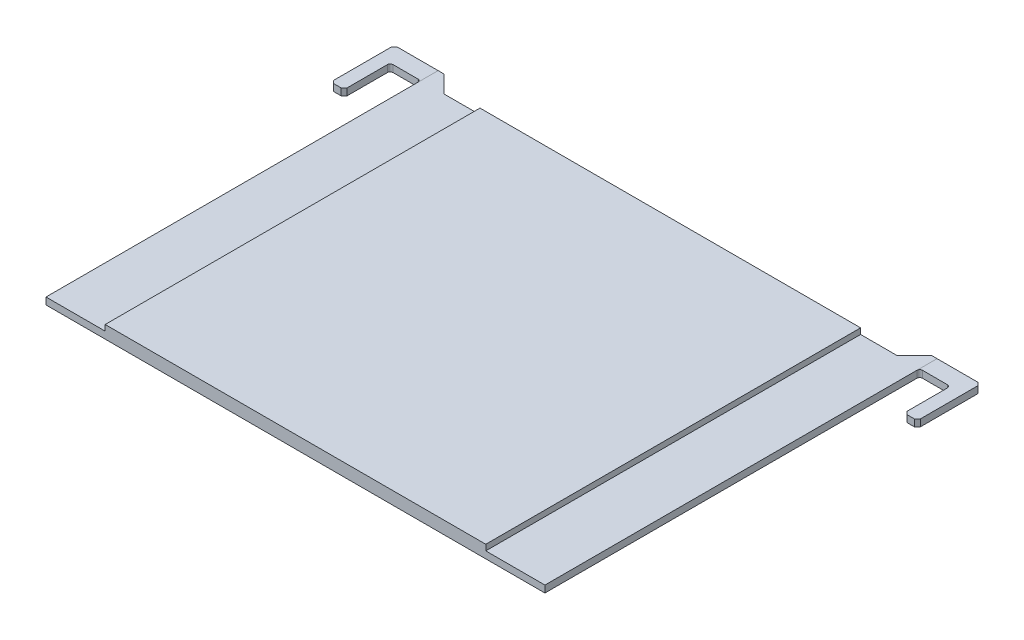
ISO-10303-21;
HEADER;
FILE_DESCRIPTION(('STEP AP214'),'2;1');
FILE_NAME('part.step','',(''),(''),'','','');
FILE_SCHEMA(('AUTOMOTIVE_DESIGN { 1 0 10303 214 1 1 1 1 }'));
ENDSEC;
DATA;
#1=APPLICATION_CONTEXT('core data for automotive mechanical design processes');
#2=APPLICATION_PROTOCOL_DEFINITION('international standard','automotive_design',2000,#1);
#3=PRODUCT_CONTEXT('',#1,'mechanical');
#4=PRODUCT('Part','Part','',(#3));
#5=PRODUCT_RELATED_PRODUCT_CATEGORY('part','',(#4));
#6=PRODUCT_DEFINITION_FORMATION('','',#4);
#7=PRODUCT_DEFINITION_CONTEXT('part definition',#1,'design');
#8=PRODUCT_DEFINITION('design','',#6,#7);
#9=PRODUCT_DEFINITION_SHAPE('','',#8);
#10=(LENGTH_UNIT() NAMED_UNIT(*) SI_UNIT(.MILLI.,.METRE.));
#11=(NAMED_UNIT(*) PLANE_ANGLE_UNIT() SI_UNIT($,.RADIAN.));
#12=(NAMED_UNIT(*) SI_UNIT($,.STERADIAN.) SOLID_ANGLE_UNIT());
#13=UNCERTAINTY_MEASURE_WITH_UNIT(LENGTH_MEASURE(1.E-05),#10,'distance_accuracy_value','');
#14=(GEOMETRIC_REPRESENTATION_CONTEXT(3) GLOBAL_UNCERTAINTY_ASSIGNED_CONTEXT((#13)) GLOBAL_UNIT_ASSIGNED_CONTEXT((#10,
#11,#12)) REPRESENTATION_CONTEXT('',''));
#15=CARTESIAN_POINT('',(0.,0.,0.));
#16=DIRECTION('',(0.,0.,1.));
#17=DIRECTION('',(1.,0.,0.));
#18=AXIS2_PLACEMENT_3D('',#15,#16,#17);
#19=CARTESIAN_POINT('',(0.,0.,-32.49));
#20=DIRECTION('',(0.,0.,-1.));
#21=DIRECTION('',(-1.,0.,0.));
#22=AXIS2_PLACEMENT_3D('',#19,#20,#21);
#23=PLANE('',#22);
#24=DIRECTION('',(-1.,0.,0.));
#25=VECTOR('',#24,1.);
#26=CARTESIAN_POINT('',(0.,0.,-32.49));
#27=LINE('',#26,#25);
#28=CARTESIAN_POINT('',(48.0591395479017,0.,-32.49));
#29=VERTEX_POINT('',#28);
#30=CARTESIAN_POINT('',(43.76,0.,-32.49));
#31=VERTEX_POINT('',#30);
#32=EDGE_CURVE('E291',#29,#31,#27,.T.);
#33=ORIENTED_EDGE('',*,*,#32,.F.);
#34=DIRECTION('',(0.,-1.,0.));
#35=VECTOR('',#34,1.);
#36=CARTESIAN_POINT('',(48.0591395479017,1.19907431198226,-32.49));
#37=LINE('',#36,#35);
#38=CARTESIAN_POINT('',(48.0591395479017,1.19907431198228,-32.49));
#39=VERTEX_POINT('',#38);
#40=EDGE_CURVE('E467',#29,#39,#37,.F.);
#41=ORIENTED_EDGE('',*,*,#40,.T.);
#42=DIRECTION('',(1.,0.,0.));
#43=VECTOR('',#42,1.);
#44=CARTESIAN_POINT('',(0.,1.19907431198248,-32.49));
#45=LINE('',#44,#43);
#46=CARTESIAN_POINT('',(43.76,1.19907431198229,-32.49));
#47=VERTEX_POINT('',#46);
#48=EDGE_CURVE('E297',#47,#39,#45,.T.);
#49=ORIENTED_EDGE('',*,*,#48,.F.);
#50=DIRECTION('',(0.,-1.,0.));
#51=VECTOR('',#50,1.);
#52=CARTESIAN_POINT('',(43.76,0.,-32.49));
#53=LINE('',#52,#51);
#54=EDGE_CURVE('E464',#47,#31,#53,.T.);
#55=ORIENTED_EDGE('',*,*,#54,.T.);
#56=EDGE_LOOP('',(#33,#41,#49,#55));
#57=FACE_BOUND('',#56,.T.);
#58=ADVANCED_FACE('F41',(#57),#23,.F.);
#59=CARTESIAN_POINT('',(-43.26,1.2,-32.5));
#60=DIRECTION('',(0.,0.,1.));
#61=DIRECTION('',(1.,0.,0.));
#62=AXIS2_PLACEMENT_3D('',#59,#60,#61);
#63=PLANE('',#62);
#64=DIRECTION('',(-1.,0.,0.));
#65=VECTOR('',#64,1.);
#66=CARTESIAN_POINT('',(-43.26,0.,-32.5));
#67=LINE('',#66,#65);
#68=CARTESIAN_POINT('',(39.26,0.,-32.5));
#69=VERTEX_POINT('',#68);
#70=CARTESIAN_POINT('',(-39.26,0.,-32.5));
#71=VERTEX_POINT('',#70);
#72=EDGE_CURVE('E365',#69,#71,#67,.T.);
#73=ORIENTED_EDGE('',*,*,#72,.T.);
#74=DIRECTION('',(0.,1.,0.));
#75=VECTOR('',#74,1.);
#76=CARTESIAN_POINT('',(-39.26,1.2,-32.5));
#77=LINE('',#76,#75);
#78=CARTESIAN_POINT('',(-39.26,1.2,-32.5));
#79=VERTEX_POINT('',#78);
#80=EDGE_CURVE('E396',#71,#79,#77,.T.);
#81=ORIENTED_EDGE('',*,*,#80,.T.);
#82=DIRECTION('',(-1.,0.,0.));
#83=VECTOR('',#82,1.);
#84=CARTESIAN_POINT('',(-43.26,1.2,-32.5));
#85=LINE('',#84,#83);
#86=CARTESIAN_POINT('',(-33.,1.2,-32.5));
#87=VERTEX_POINT('',#86);
#88=EDGE_CURVE('E282',#87,#79,#85,.T.);
#89=ORIENTED_EDGE('',*,*,#88,.F.);
#90=DIRECTION('',(0.,1.,0.));
#91=VECTOR('',#90,1.);
#92=CARTESIAN_POINT('',(-33.,1.2,-32.5));
#93=LINE('',#92,#91);
#94=CARTESIAN_POINT('',(-33.,2.2,-32.5));
#95=VERTEX_POINT('',#94);
#96=EDGE_CURVE('E338',#87,#95,#93,.T.);
#97=ORIENTED_EDGE('',*,*,#96,.T.);
#98=DIRECTION('',(1.,0.,0.));
#99=VECTOR('',#98,1.);
#100=CARTESIAN_POINT('',(-33.,2.2,-32.5));
#101=LINE('',#100,#99);
#102=CARTESIAN_POINT('',(33.,2.2,-32.5));
#103=VERTEX_POINT('',#102);
#104=EDGE_CURVE('E335',#95,#103,#101,.T.);
#105=ORIENTED_EDGE('',*,*,#104,.T.);
#106=DIRECTION('',(0.,-1.,0.));
#107=VECTOR('',#106,1.);
#108=CARTESIAN_POINT('',(33.,1.2,-32.5));
#109=LINE('',#108,#107);
#110=CARTESIAN_POINT('',(33.,1.2,-32.5));
#111=VERTEX_POINT('',#110);
#112=EDGE_CURVE('E332',#103,#111,#109,.T.);
#113=ORIENTED_EDGE('',*,*,#112,.T.);
#114=CARTESIAN_POINT('',(39.26,1.2,-32.5));
#115=VERTEX_POINT('',#114);
#116=EDGE_CURVE('E357',#115,#111,#85,.T.);
#117=ORIENTED_EDGE('',*,*,#116,.F.);
#118=DIRECTION('',(0.,-1.,0.));
#119=VECTOR('',#118,1.);
#120=CARTESIAN_POINT('',(39.26,0.,-32.5));
#121=LINE('',#120,#119);
#122=EDGE_CURVE('E394',#115,#69,#121,.T.);
#123=ORIENTED_EDGE('',*,*,#122,.T.);
#124=EDGE_LOOP('',(#73,#81,#89,#97,#105,#113,#117,#123));
#125=FACE_BOUND('',#124,.T.);
#126=ADVANCED_FACE('F537',(#125),#63,.F.);
#127=CARTESIAN_POINT('',(-43.26,1.2,32.5));
#128=DIRECTION('',(1.,0.,0.));
#129=DIRECTION('',(0.,0.,-1.));
#130=AXIS2_PLACEMENT_3D('',#127,#128,#129);
#131=PLANE('',#130);
#132=DIRECTION('',(0.,0.,-1.));
#133=VECTOR('',#132,1.);
#134=CARTESIAN_POINT('',(-43.26,1.19907431198226,-32.49));
#135=LINE('',#134,#133);
#136=CARTESIAN_POINT('',(-43.26,1.19907431198226,-31.99));
#137=VERTEX_POINT('',#136);
#138=CARTESIAN_POINT('',(-43.26,1.19907431198226,-35.5));
#139=VERTEX_POINT('',#138);
#140=EDGE_CURVE('E56',#137,#139,#135,.T.);
#141=ORIENTED_EDGE('',*,*,#140,.F.);
#142=DIRECTION('',(0.,1.,0.));
#143=VECTOR('',#142,1.);
#144=CARTESIAN_POINT('',(-43.26,0.,-31.99));
#145=LINE('',#144,#143);
#146=CARTESIAN_POINT('',(-43.26,0.,-31.99));
#147=VERTEX_POINT('',#146);
#148=EDGE_CURVE('E61',#137,#147,#145,.F.);
#149=ORIENTED_EDGE('',*,*,#148,.T.);
#150=DIRECTION('',(0.,0.,1.));
#151=VECTOR('',#150,1.);
#152=CARTESIAN_POINT('',(-43.26,0.,32.5));
#153=LINE('',#152,#151);
#154=CARTESIAN_POINT('',(-43.26,0.,32.5));
#155=VERTEX_POINT('',#154);
#156=EDGE_CURVE('E368',#147,#155,#153,.T.);
#157=ORIENTED_EDGE('',*,*,#156,.T.);
#158=DIRECTION('',(0.,-1.,0.));
#159=VECTOR('',#158,1.);
#160=CARTESIAN_POINT('',(-43.26,1.2,32.5));
#161=LINE('',#160,#159);
#162=CARTESIAN_POINT('',(-43.26,1.2,32.5));
#163=VERTEX_POINT('',#162);
#164=EDGE_CURVE('E372',#163,#155,#161,.T.);
#165=ORIENTED_EDGE('',*,*,#164,.F.);
#166=DIRECTION('',(0.,0.,1.));
#167=VECTOR('',#166,1.);
#168=CARTESIAN_POINT('',(-43.26,1.2,32.5));
#169=LINE('',#168,#167);
#170=CARTESIAN_POINT('',(-43.26,1.2,-35.5));
#171=VERTEX_POINT('',#170);
#172=EDGE_CURVE('E359',#171,#163,#169,.T.);
#173=ORIENTED_EDGE('',*,*,#172,.F.);
#174=DIRECTION('',(0.,1.,0.));
#175=VECTOR('',#174,1.);
#176=CARTESIAN_POINT('',(-43.26,0.,-35.5));
#177=LINE('',#176,#175);
#178=EDGE_CURVE('E312',#139,#171,#177,.T.);
#179=ORIENTED_EDGE('',*,*,#178,.F.);
#180=EDGE_LOOP('',(#141,#149,#157,#165,#173,#179));
#181=FACE_BOUND('',#180,.T.);
#182=ADVANCED_FACE('F563',(#181),#131,.F.);
#183=CARTESIAN_POINT('',(0.,1.2,0.));
#184=DIRECTION('',(0.,-1.,0.));
#185=DIRECTION('',(0.,0.,-1.));
#186=AXIS2_PLACEMENT_3D('',#183,#184,#185);
#187=PLANE('',#186);
#188=ORIENTED_EDGE('',*,*,#88,.T.);
#189=DIRECTION('',(-0.707106781186552,0.,-0.707106781186543));
#190=VECTOR('',#189,1.);
#191=CARTESIAN_POINT('',(-3.37999999999973,1.2,3.37999999999977));
#192=LINE('',#191,#190);
#193=CARTESIAN_POINT('',(-40.26,1.2,-33.5));
#194=VERTEX_POINT('',#193);
#195=EDGE_CURVE('E399',#79,#194,#192,.T.);
#196=ORIENTED_EDGE('',*,*,#195,.T.);
#197=DIRECTION('',(0.707106781186545,0.,0.70710678118655));
#198=VECTOR('',#197,1.);
#199=CARTESIAN_POINT('',(-42.26,1.2,-35.5));
#200=LINE('',#199,#198);
#201=CARTESIAN_POINT('',(-42.26,1.2,-35.5));
#202=VERTEX_POINT('',#201);
#203=EDGE_CURVE('E392',#194,#202,#200,.F.);
#204=ORIENTED_EDGE('',*,*,#203,.T.);
#205=DIRECTION('',(1.,0.,0.));
#206=VECTOR('',#205,1.);
#207=CARTESIAN_POINT('',(0.,1.2,-35.5));
#208=LINE('',#207,#206);
#209=EDGE_CURVE('E315',#171,#202,#208,.T.);
#210=ORIENTED_EDGE('',*,*,#209,.F.);
#211=ORIENTED_EDGE('',*,*,#172,.T.);
#212=DIRECTION('',(1.,0.,0.));
#213=VECTOR('',#212,1.);
#214=CARTESIAN_POINT('',(-43.26,1.2,32.5));
#215=LINE('',#214,#213);
#216=CARTESIAN_POINT('',(-33.,1.2,32.5));
#217=VERTEX_POINT('',#216);
#218=EDGE_CURVE('E361',#163,#217,#215,.T.);
#219=ORIENTED_EDGE('',*,*,#218,.T.);
#220=DIRECTION('',(0.,0.,1.));
#221=VECTOR('',#220,1.);
#222=CARTESIAN_POINT('',(-33.,1.2,-98.507575322837));
#223=LINE('',#222,#221);
#224=EDGE_CURVE('E349',#87,#217,#223,.T.);
#225=ORIENTED_EDGE('',*,*,#224,.F.);
#226=EDGE_LOOP('',(#188,#196,#204,#210,#211,#219,#225));
#227=FACE_BOUND('',#226,.T.);
#228=ADVANCED_FACE('F603',(#227),#187,.F.);
#229=CARTESIAN_POINT('',(43.26,1.2,32.5));
#230=DIRECTION('',(-1.,0.,0.));
#231=DIRECTION('',(0.,0.,1.));
#232=AXIS2_PLACEMENT_3D('',#229,#230,#231);
#233=PLANE('',#232);
#234=DIRECTION('',(0.,0.,-1.));
#235=VECTOR('',#234,1.);
#236=CARTESIAN_POINT('',(43.26,0.,32.5));
#237=LINE('',#236,#235);
#238=CARTESIAN_POINT('',(43.26,0.,32.5));
#239=VERTEX_POINT('',#238);
#240=CARTESIAN_POINT('',(43.26,0.,-31.99));
#241=VERTEX_POINT('',#240);
#242=EDGE_CURVE('E340',#239,#241,#237,.T.);
#243=ORIENTED_EDGE('',*,*,#242,.T.);
#244=DIRECTION('',(0.,-1.,0.));
#245=VECTOR('',#244,1.);
#246=CARTESIAN_POINT('',(43.26,1.19907431198228,-31.99));
#247=LINE('',#246,#245);
#248=CARTESIAN_POINT('',(43.26,1.1990743119823,-31.99));
#249=VERTEX_POINT('',#248);
#250=EDGE_CURVE('E469',#241,#249,#247,.F.);
#251=ORIENTED_EDGE('',*,*,#250,.T.);
#252=DIRECTION('',(0.,0.,-1.));
#253=VECTOR('',#252,1.);
#254=CARTESIAN_POINT('',(43.26,1.1990743119823,-32.49));
#255=LINE('',#254,#253);
#256=CARTESIAN_POINT('',(43.26,1.1990743119823,-35.5));
#257=VERTEX_POINT('',#256);
#258=EDGE_CURVE('E288',#249,#257,#255,.T.);
#259=ORIENTED_EDGE('',*,*,#258,.T.);
#260=DIRECTION('',(0.,-1.,0.));
#261=VECTOR('',#260,1.);
#262=CARTESIAN_POINT('',(43.26,0.,-35.5));
#263=LINE('',#262,#261);
#264=CARTESIAN_POINT('',(43.26,1.2,-35.5));
#265=VERTEX_POINT('',#264);
#266=EDGE_CURVE('E265',#265,#257,#263,.T.);
#267=ORIENTED_EDGE('',*,*,#266,.F.);
#268=DIRECTION('',(0.,0.,-1.));
#269=VECTOR('',#268,1.);
#270=CARTESIAN_POINT('',(43.26,1.2,32.5));
#271=LINE('',#270,#269);
#272=CARTESIAN_POINT('',(43.26,1.2,32.5));
#273=VERTEX_POINT('',#272);
#274=EDGE_CURVE('E275',#273,#265,#271,.T.);
#275=ORIENTED_EDGE('',*,*,#274,.F.);
#276=DIRECTION('',(0.,-1.,0.));
#277=VECTOR('',#276,1.);
#278=CARTESIAN_POINT('',(43.26,1.2,32.5));
#279=LINE('',#278,#277);
#280=EDGE_CURVE('E363',#273,#239,#279,.T.);
#281=ORIENTED_EDGE('',*,*,#280,.T.);
#282=EDGE_LOOP('',(#243,#251,#259,#267,#275,#281));
#283=FACE_BOUND('',#282,.T.);
#284=ADVANCED_FACE('F286',(#283),#233,.F.);
#285=CARTESIAN_POINT('',(-43.26,1.2,32.5));
#286=DIRECTION('',(0.,0.,-1.));
#287=DIRECTION('',(-1.,0.,0.));
#288=AXIS2_PLACEMENT_3D('',#285,#286,#287);
#289=PLANE('',#288);
#290=DIRECTION('',(1.,0.,0.));
#291=VECTOR('',#290,1.);
#292=CARTESIAN_POINT('',(-43.26,0.,32.5));
#293=LINE('',#292,#291);
#294=EDGE_CURVE('E283',#155,#239,#293,.T.);
#295=ORIENTED_EDGE('',*,*,#294,.T.);
#296=ORIENTED_EDGE('',*,*,#280,.F.);
#297=CARTESIAN_POINT('',(33.,1.2,32.5));
#298=VERTEX_POINT('',#297);
#299=EDGE_CURVE('E278',#298,#273,#215,.T.);
#300=ORIENTED_EDGE('',*,*,#299,.F.);
#301=DIRECTION('',(0.,1.,0.));
#302=VECTOR('',#301,1.);
#303=CARTESIAN_POINT('',(33.,1.2,32.5));
#304=LINE('',#303,#302);
#305=CARTESIAN_POINT('',(33.,2.2,32.5));
#306=VERTEX_POINT('',#305);
#307=EDGE_CURVE('E343',#298,#306,#304,.T.);
#308=ORIENTED_EDGE('',*,*,#307,.T.);
#309=DIRECTION('',(-1.,0.,0.));
#310=VECTOR('',#309,1.);
#311=CARTESIAN_POINT('',(-33.,2.2,32.5));
#312=LINE('',#311,#310);
#313=CARTESIAN_POINT('',(-33.,2.2,32.5));
#314=VERTEX_POINT('',#313);
#315=EDGE_CURVE('E346',#306,#314,#312,.T.);
#316=ORIENTED_EDGE('',*,*,#315,.T.);
#317=DIRECTION('',(0.,-1.,0.));
#318=VECTOR('',#317,1.);
#319=CARTESIAN_POINT('',(-33.,1.2,32.5));
#320=LINE('',#319,#318);
#321=EDGE_CURVE('E326',#314,#217,#320,.T.);
#322=ORIENTED_EDGE('',*,*,#321,.T.);
#323=ORIENTED_EDGE('',*,*,#218,.F.);
#324=ORIENTED_EDGE('',*,*,#164,.T.);
#325=EDGE_LOOP('',(#295,#296,#300,#308,#316,#322,#323,#324));
#326=FACE_BOUND('',#325,.T.);
#327=ADVANCED_FACE('F602',(#326),#289,.F.);
#328=DIRECTION('',(1.,0.,0.));
#329=VECTOR('',#328,1.);
#330=CARTESIAN_POINT('',(0.,1.2,-35.5));
#331=LINE('',#330,#329);
#332=CARTESIAN_POINT('',(42.26,1.2,-35.5));
#333=VERTEX_POINT('',#332);
#334=EDGE_CURVE('E260',#333,#265,#331,.T.);
#335=ORIENTED_EDGE('',*,*,#334,.F.);
#336=DIRECTION('',(-0.70710678118655,0.,0.707106781186545));
#337=VECTOR('',#336,1.);
#338=CARTESIAN_POINT('',(40.26,1.2,-33.5));
#339=LINE('',#338,#337);
#340=CARTESIAN_POINT('',(40.26,1.2,-33.5));
#341=VERTEX_POINT('',#340);
#342=EDGE_CURVE('E382',#333,#341,#339,.T.);
#343=ORIENTED_EDGE('',*,*,#342,.T.);
#344=DIRECTION('',(0.707106781186543,0.,-0.707106781186552));
#345=VECTOR('',#344,1.);
#346=CARTESIAN_POINT('',(3.38000000000026,1.2,3.38000000000021));
#347=LINE('',#346,#345);
#348=EDGE_CURVE('E403',#341,#115,#347,.F.);
#349=ORIENTED_EDGE('',*,*,#348,.T.);
#350=ORIENTED_EDGE('',*,*,#116,.T.);
#351=DIRECTION('',(0.,0.,1.));
#352=VECTOR('',#351,1.);
#353=CARTESIAN_POINT('',(33.,1.2,-98.507575322837));
#354=LINE('',#353,#352);
#355=EDGE_CURVE('E353',#111,#298,#354,.T.);
#356=ORIENTED_EDGE('',*,*,#355,.T.);
#357=ORIENTED_EDGE('',*,*,#299,.T.);
#358=ORIENTED_EDGE('',*,*,#274,.T.);
#359=EDGE_LOOP('',(#335,#343,#349,#350,#356,#357,#358));
#360=FACE_BOUND('',#359,.T.);
#361=ADVANCED_FACE('F276',(#360),#187,.F.);
#362=CARTESIAN_POINT('',(0.,0.,0.));
#363=DIRECTION('',(0.,-1.,0.));
#364=DIRECTION('',(0.,0.,-1.));
#365=AXIS2_PLACEMENT_3D('',#362,#363,#364);
#366=PLANE('',#365);
#367=DIRECTION('',(0.,0.,-1.));
#368=VECTOR('',#367,1.);
#369=CARTESIAN_POINT('',(-48.5591395479017,0.,-24.49));
#370=LINE('',#369,#368);
#371=CARTESIAN_POINT('',(-48.5591395479017,0.,-24.99));
#372=VERTEX_POINT('',#371);
#373=CARTESIAN_POINT('',(-48.5591395479017,0.,-31.99));
#374=VERTEX_POINT('',#373);
#375=EDGE_CURVE('E511',#372,#374,#370,.T.);
#376=ORIENTED_EDGE('',*,*,#375,.F.);
#377=DIRECTION('',(0.707106781186548,0.,-0.707106781186548));
#378=VECTOR('',#377,1.);
#379=CARTESIAN_POINT('',(-36.7745697739508,0.,-36.7745697739508));
#380=LINE('',#379,#378);
#381=CARTESIAN_POINT('',(-49.0591395479017,0.,-24.49));
#382=VERTEX_POINT('',#381);
#383=EDGE_CURVE('E420',#372,#382,#380,.F.);
#384=ORIENTED_EDGE('',*,*,#383,.T.);
#385=DIRECTION('',(1.,0.,0.));
#386=VECTOR('',#385,1.);
#387=CARTESIAN_POINT('',(0.,0.,-24.49));
#388=LINE('',#387,#386);
#389=CARTESIAN_POINT('',(-50.3591395479017,0.,-24.49));
#390=VERTEX_POINT('',#389);
#391=EDGE_CURVE('E518',#390,#382,#388,.T.);
#392=ORIENTED_EDGE('',*,*,#391,.F.);
#393=DIRECTION('',(-0.707106781186548,0.,-0.707106781186548));
#394=VECTOR('',#393,1.);
#395=CARTESIAN_POINT('',(-12.9345697739509,0.,12.9345697739509));
#396=LINE('',#395,#394);
#397=CARTESIAN_POINT('',(-50.8591395479017,0.,-24.99));
#398=VERTEX_POINT('',#397);
#399=EDGE_CURVE('E418',#390,#398,#396,.T.);
#400=ORIENTED_EDGE('',*,*,#399,.T.);
#401=DIRECTION('',(0.,0.,-1.));
#402=VECTOR('',#401,1.);
#403=CARTESIAN_POINT('',(-50.8591395479017,0.,-32.49));
#404=LINE('',#403,#402);
#405=CARTESIAN_POINT('',(-50.8591395479017,0.,-35.));
#406=VERTEX_POINT('',#405);
#407=EDGE_CURVE('E324',#398,#406,#404,.T.);
#408=ORIENTED_EDGE('',*,*,#407,.T.);
#409=DIRECTION('',(0.707106781186548,0.,-0.707106781186548));
#410=VECTOR('',#409,1.);
#411=CARTESIAN_POINT('',(-42.9295697739508,0.,-42.9295697739508));
#412=LINE('',#411,#410);
#413=CARTESIAN_POINT('',(-50.3591395479017,0.,-35.5));
#414=VERTEX_POINT('',#413);
#415=EDGE_CURVE('E416',#406,#414,#412,.T.);
#416=ORIENTED_EDGE('',*,*,#415,.T.);
#417=DIRECTION('',(1.,0.,0.));
#418=VECTOR('',#417,1.);
#419=CARTESIAN_POINT('',(0.,0.,-35.5));
#420=LINE('',#419,#418);
#421=CARTESIAN_POINT('',(-42.26,0.,-35.5));
#422=VERTEX_POINT('',#421);
#423=EDGE_CURVE('E303',#414,#422,#420,.T.);
#424=ORIENTED_EDGE('',*,*,#423,.T.);
#425=DIRECTION('',(-0.707106781186545,0.,-0.70710678118655));
#426=VECTOR('',#425,1.);
#427=CARTESIAN_POINT('',(-3.38000000000015,0.,3.38000000000013));
#428=LINE('',#427,#426);
#429=CARTESIAN_POINT('',(-40.26,0.,-33.5));
#430=VERTEX_POINT('',#429);
#431=EDGE_CURVE('E387',#422,#430,#428,.F.);
#432=ORIENTED_EDGE('',*,*,#431,.T.);
#433=DIRECTION('',(0.707106781186552,0.,0.707106781186543));
#434=VECTOR('',#433,1.);
#435=CARTESIAN_POINT('',(-39.26,0.,-32.5));
#436=LINE('',#435,#434);
#437=EDGE_CURVE('E401',#430,#71,#436,.T.);
#438=ORIENTED_EDGE('',*,*,#437,.T.);
#439=ORIENTED_EDGE('',*,*,#72,.F.);
#440=DIRECTION('',(-0.707106781186543,0.,0.707106781186552));
#441=VECTOR('',#440,1.);
#442=CARTESIAN_POINT('',(40.26,0.,-33.5));
#443=LINE('',#442,#441);
#444=CARTESIAN_POINT('',(40.26,0.,-33.5));
#445=VERTEX_POINT('',#444);
#446=EDGE_CURVE('E405',#69,#445,#443,.F.);
#447=ORIENTED_EDGE('',*,*,#446,.T.);
#448=DIRECTION('',(0.70710678118655,0.,-0.707106781186545));
#449=VECTOR('',#448,1.);
#450=CARTESIAN_POINT('',(3.37999999999985,0.,3.37999999999987));
#451=LINE('',#450,#449);
#452=CARTESIAN_POINT('',(42.26,0.,-35.5));
#453=VERTEX_POINT('',#452);
#454=EDGE_CURVE('E378',#445,#453,#451,.T.);
#455=ORIENTED_EDGE('',*,*,#454,.T.);
#456=DIRECTION('',(-1.,0.,0.));
#457=VECTOR('',#456,1.);
#458=CARTESIAN_POINT('',(0.,0.,-35.5));
#459=LINE('',#458,#457);
#460=CARTESIAN_POINT('',(50.3591395479017,0.,-35.5));
#461=VERTEX_POINT('',#460);
#462=EDGE_CURVE('E272',#461,#453,#459,.T.);
#463=ORIENTED_EDGE('',*,*,#462,.F.);
#464=DIRECTION('',(-0.707106781186548,0.,-0.707106781186548));
#465=VECTOR('',#464,1.);
#466=CARTESIAN_POINT('',(42.9295697739508,0.,-42.9295697739508));
#467=LINE('',#466,#465);
#468=CARTESIAN_POINT('',(50.8591395479017,0.,-35.));
#469=VERTEX_POINT('',#468);
#470=EDGE_CURVE('E414',#461,#469,#467,.F.);
#471=ORIENTED_EDGE('',*,*,#470,.T.);
#472=DIRECTION('',(0.,0.,-1.));
#473=VECTOR('',#472,1.);
#474=CARTESIAN_POINT('',(50.8591395479017,0.,-32.49));
#475=LINE('',#474,#473);
#476=CARTESIAN_POINT('',(50.8591395479017,0.,-24.99));
#477=VERTEX_POINT('',#476);
#478=EDGE_CURVE('E300',#477,#469,#475,.T.);
#479=ORIENTED_EDGE('',*,*,#478,.F.);
#480=DIRECTION('',(0.707106781186548,0.,-0.707106781186548));
#481=VECTOR('',#480,1.);
#482=CARTESIAN_POINT('',(12.9345697739508,0.,12.9345697739508));
#483=LINE('',#482,#481);
#484=CARTESIAN_POINT('',(50.3591395479017,-7.53238472798928E-13,-24.49));
#485=VERTEX_POINT('',#484);
#486=EDGE_CURVE('E412',#477,#485,#483,.F.);
#487=ORIENTED_EDGE('',*,*,#486,.T.);
#488=DIRECTION('',(-1.,4.1846581822163E-13,0.));
#489=VECTOR('',#488,1.);
#490=CARTESIAN_POINT('',(0.,2.0320340063051E-11,-24.49));
#491=LINE('',#490,#489);
#492=CARTESIAN_POINT('',(49.0591395479017,-2.09232909110809E-13,-24.49));
#493=VERTEX_POINT('',#492);
#494=EDGE_CURVE('E1102',#485,#493,#491,.T.);
#495=ORIENTED_EDGE('',*,*,#494,.T.);
#496=DIRECTION('',(-0.707106781186548,0.,-0.707106781186548));
#497=VECTOR('',#496,1.);
#498=CARTESIAN_POINT('',(36.7745697739508,0.,-36.7745697739508));
#499=LINE('',#498,#497);
#500=CARTESIAN_POINT('',(48.5591395479017,0.,-24.99));
#501=VERTEX_POINT('',#500);
#502=EDGE_CURVE('E410',#493,#501,#499,.T.);
#503=ORIENTED_EDGE('',*,*,#502,.T.);
#504=DIRECTION('',(0.,0.,-1.));
#505=VECTOR('',#504,1.);
#506=CARTESIAN_POINT('',(48.5591395479017,0.,-24.49));
#507=LINE('',#506,#505);
#508=CARTESIAN_POINT('',(48.5591395479017,0.,-31.99));
#509=VERTEX_POINT('',#508);
#510=EDGE_CURVE('E1098',#501,#509,#507,.T.);
#511=ORIENTED_EDGE('',*,*,#510,.T.);
#512=CARTESIAN_POINT('',(48.0591395479017,0.,-31.99));
#513=DIRECTION('',(0.,-1.,0.));
#514=DIRECTION('',(0.,0.,-1.));
#515=AXIS2_PLACEMENT_3D('',#512,#513,#514);
#516=CIRCLE('',#515,0.5);
#517=EDGE_CURVE('E480',#509,#29,#516,.F.);
#518=ORIENTED_EDGE('',*,*,#517,.T.);
#519=ORIENTED_EDGE('',*,*,#32,.T.);
#520=CARTESIAN_POINT('',(43.76,0.,-31.99));
#521=DIRECTION('',(0.,-1.,0.));
#522=DIRECTION('',(0.,0.,-1.));
#523=AXIS2_PLACEMENT_3D('',#520,#521,#522);
#524=CIRCLE('',#523,0.5);
#525=EDGE_CURVE('E484',#31,#241,#524,.F.);
#526=ORIENTED_EDGE('',*,*,#525,.T.);
#527=ORIENTED_EDGE('',*,*,#242,.F.);
#528=ORIENTED_EDGE('',*,*,#294,.F.);
#529=ORIENTED_EDGE('',*,*,#156,.F.);
#530=CARTESIAN_POINT('',(-43.76,0.,-31.99));
#531=DIRECTION('',(0.,-1.,0.));
#532=DIRECTION('',(0.,0.,-1.));
#533=AXIS2_PLACEMENT_3D('',#530,#531,#532);
#534=CIRCLE('',#533,0.5);
#535=CARTESIAN_POINT('',(-43.76,0.,-32.49));
#536=VERTEX_POINT('',#535);
#537=EDGE_CURVE('E11',#147,#536,#534,.F.);
#538=ORIENTED_EDGE('',*,*,#537,.T.);
#539=DIRECTION('',(1.,0.,0.));
#540=VECTOR('',#539,1.);
#541=CARTESIAN_POINT('',(0.,0.,-32.49));
#542=LINE('',#541,#540);
#543=CARTESIAN_POINT('',(-48.0591395479017,0.,-32.49));
#544=VERTEX_POINT('',#543);
#545=EDGE_CURVE('E318',#544,#536,#542,.T.);
#546=ORIENTED_EDGE('',*,*,#545,.F.);
#547=CARTESIAN_POINT('',(-48.0591395479017,0.,-31.99));
#548=DIRECTION('',(0.,-1.,0.));
#549=DIRECTION('',(0.,0.,-1.));
#550=AXIS2_PLACEMENT_3D('',#547,#548,#549);
#551=CIRCLE('',#550,0.5);
#552=EDGE_CURVE('E488',#544,#374,#551,.F.);
#553=ORIENTED_EDGE('',*,*,#552,.T.);
#554=EDGE_LOOP('',(#376,#384,#392,#400,#408,#416,#424,#432,#438,#439,#447,#455,#463,#471,#479,
#487,#495,#503,#511,#518,#519,#526,#527,#528,#529,#538,#546,#553));
#555=FACE_BOUND('',#554,.T.);
#556=ADVANCED_FACE('F501',(#555),#366,.T.);
#557=CARTESIAN_POINT('',(-33.,1.2,-98.507575322837));
#558=DIRECTION('',(-1.,0.,0.));
#559=DIRECTION('',(0.,0.,1.));
#560=AXIS2_PLACEMENT_3D('',#557,#558,#559);
#561=PLANE('',#560);
#562=ORIENTED_EDGE('',*,*,#96,.F.);
#563=ORIENTED_EDGE('',*,*,#224,.T.);
#564=ORIENTED_EDGE('',*,*,#321,.F.);
#565=DIRECTION('',(0.,0.,1.));
#566=VECTOR('',#565,1.);
#567=CARTESIAN_POINT('',(-33.,2.2,-98.507575322837));
#568=LINE('',#567,#566);
#569=EDGE_CURVE('E336',#95,#314,#568,.T.);
#570=ORIENTED_EDGE('',*,*,#569,.F.);
#571=EDGE_LOOP('',(#562,#563,#564,#570));
#572=FACE_BOUND('',#571,.T.);
#573=ADVANCED_FACE('F592',(#572),#561,.T.);
#574=CARTESIAN_POINT('',(-33.,2.2,-98.507575322837));
#575=DIRECTION('',(0.,1.,0.));
#576=DIRECTION('',(-1.,0.,0.));
#577=AXIS2_PLACEMENT_3D('',#574,#575,#576);
#578=PLANE('',#577);
#579=ORIENTED_EDGE('',*,*,#104,.F.);
#580=ORIENTED_EDGE('',*,*,#569,.T.);
#581=ORIENTED_EDGE('',*,*,#315,.F.);
#582=DIRECTION('',(0.,0.,1.));
#583=VECTOR('',#582,1.);
#584=CARTESIAN_POINT('',(33.,2.2,-98.507575322837));
#585=LINE('',#584,#583);
#586=EDGE_CURVE('E351',#103,#306,#585,.T.);
#587=ORIENTED_EDGE('',*,*,#586,.F.);
#588=EDGE_LOOP('',(#579,#580,#581,#587));
#589=FACE_BOUND('',#588,.T.);
#590=ADVANCED_FACE('F589',(#589),#578,.T.);
#591=CARTESIAN_POINT('',(33.,1.2,-98.507575322837));
#592=DIRECTION('',(1.,0.,0.));
#593=DIRECTION('',(0.,0.,-1.));
#594=AXIS2_PLACEMENT_3D('',#591,#592,#593);
#595=PLANE('',#594);
#596=ORIENTED_EDGE('',*,*,#112,.F.);
#597=ORIENTED_EDGE('',*,*,#586,.T.);
#598=ORIENTED_EDGE('',*,*,#307,.F.);
#599=ORIENTED_EDGE('',*,*,#355,.F.);
#600=EDGE_LOOP('',(#596,#597,#598,#599));
#601=FACE_BOUND('',#600,.T.);
#602=ADVANCED_FACE('F583',(#601),#595,.T.);
#603=CARTESIAN_POINT('',(0.,0.,-32.49));
#604=DIRECTION('',(0.,0.,-1.));
#605=DIRECTION('',(-1.,0.,0.));
#606=AXIS2_PLACEMENT_3D('',#603,#604,#605);
#607=PLANE('',#606);
#608=DIRECTION('',(-1.,0.,0.));
#609=VECTOR('',#608,1.);
#610=CARTESIAN_POINT('',(0.,1.19907431198226,-32.49));
#611=LINE('',#610,#609);
#612=CARTESIAN_POINT('',(-43.76,1.19907431198226,-32.49));
#613=VERTEX_POINT('',#612);
#614=CARTESIAN_POINT('',(-48.0591395479017,1.19907431198226,-32.49));
#615=VERTEX_POINT('',#614);
#616=EDGE_CURVE('E321',#613,#615,#611,.T.);
#617=ORIENTED_EDGE('',*,*,#616,.T.);
#618=DIRECTION('',(0.,-1.,0.));
#619=VECTOR('',#618,1.);
#620=CARTESIAN_POINT('',(-48.0591395479017,0.,-32.49));
#621=LINE('',#620,#619);
#622=EDGE_CURVE('E474',#615,#544,#621,.T.);
#623=ORIENTED_EDGE('',*,*,#622,.T.);
#624=ORIENTED_EDGE('',*,*,#545,.T.);
#625=DIRECTION('',(0.,1.,0.));
#626=VECTOR('',#625,1.);
#627=CARTESIAN_POINT('',(-43.76,1.19907431198226,-32.49));
#628=LINE('',#627,#626);
#629=EDGE_CURVE('E471',#536,#613,#628,.T.);
#630=ORIENTED_EDGE('',*,*,#629,.T.);
#631=EDGE_LOOP('',(#617,#623,#624,#630));
#632=FACE_BOUND('',#631,.T.);
#633=ADVANCED_FACE('F504',(#632),#607,.F.);
#634=CARTESIAN_POINT('',(0.,1.19907431198226,-32.49));
#635=DIRECTION('',(0.,-1.,0.));
#636=DIRECTION('',(0.,0.,-1.));
#637=AXIS2_PLACEMENT_3D('',#634,#635,#636);
#638=PLANE('',#637);
#639=DIRECTION('',(-1.,0.,0.));
#640=VECTOR('',#639,1.);
#641=CARTESIAN_POINT('',(0.,1.19907431198226,-24.49));
#642=LINE('',#641,#640);
#643=CARTESIAN_POINT('',(-49.0591395479017,1.19907431198226,-24.49));
#644=VERTEX_POINT('',#643);
#645=CARTESIAN_POINT('',(-50.3591395479017,1.19907431198226,-24.49));
#646=VERTEX_POINT('',#645);
#647=EDGE_CURVE('E522',#644,#646,#642,.T.);
#648=ORIENTED_EDGE('',*,*,#647,.F.);
#649=DIRECTION('',(-0.707106781186547,0.,0.707106781186547));
#650=VECTOR('',#649,1.);
#651=CARTESIAN_POINT('',(-48.5591395479017,1.19907431198226,-24.99));
#652=LINE('',#651,#650);
#653=CARTESIAN_POINT('',(-48.5591395479017,1.19907431198226,-24.99));
#654=VERTEX_POINT('',#653);
#655=EDGE_CURVE('E431',#644,#654,#652,.F.);
#656=ORIENTED_EDGE('',*,*,#655,.T.);
#657=DIRECTION('',(0.,0.,-1.));
#658=VECTOR('',#657,1.);
#659=CARTESIAN_POINT('',(-48.5591395479017,1.19907431198226,-24.49));
#660=LINE('',#659,#658);
#661=CARTESIAN_POINT('',(-48.5591395479017,1.19907431198226,-31.99));
#662=VERTEX_POINT('',#661);
#663=EDGE_CURVE('E517',#654,#662,#660,.T.);
#664=ORIENTED_EDGE('',*,*,#663,.T.);
#665=CARTESIAN_POINT('',(-48.0591395479017,1.19907431198226,-31.99));
#666=DIRECTION('',(0.,-1.,0.));
#667=DIRECTION('',(0.,0.,-1.));
#668=AXIS2_PLACEMENT_3D('',#665,#666,#667);
#669=CIRCLE('',#668,0.5);
#670=EDGE_CURVE('E490',#662,#615,#669,.T.);
#671=ORIENTED_EDGE('',*,*,#670,.T.);
#672=ORIENTED_EDGE('',*,*,#616,.F.);
#673=CARTESIAN_POINT('',(-43.76,1.19907431198226,-31.99));
#674=DIRECTION('',(0.,-1.,0.));
#675=DIRECTION('',(0.,0.,-1.));
#676=AXIS2_PLACEMENT_3D('',#673,#674,#675);
#677=CIRCLE('',#676,0.5);
#678=EDGE_CURVE('E49',#613,#137,#677,.T.);
#679=ORIENTED_EDGE('',*,*,#678,.T.);
#680=ORIENTED_EDGE('',*,*,#140,.T.);
#681=DIRECTION('',(-1.,0.,0.));
#682=VECTOR('',#681,1.);
#683=CARTESIAN_POINT('',(0.,1.19907431198226,-35.5));
#684=LINE('',#683,#682);
#685=CARTESIAN_POINT('',(-50.3591395479017,1.19907431198226,-35.5));
#686=VERTEX_POINT('',#685);
#687=EDGE_CURVE('E309',#139,#686,#684,.T.);
#688=ORIENTED_EDGE('',*,*,#687,.T.);
#689=DIRECTION('',(-0.707106781186548,0.,0.707106781186548));
#690=VECTOR('',#689,1.);
#691=CARTESIAN_POINT('',(-50.8591395479017,1.19907431198226,-35.));
#692=LINE('',#691,#690);
#693=CARTESIAN_POINT('',(-50.8591395479017,1.19907431198226,-35.));
#694=VERTEX_POINT('',#693);
#695=EDGE_CURVE('E427',#686,#694,#692,.T.);
#696=ORIENTED_EDGE('',*,*,#695,.T.);
#697=DIRECTION('',(0.,0.,-1.));
#698=VECTOR('',#697,1.);
#699=CARTESIAN_POINT('',(-50.8591395479017,1.19907431198226,-32.49));
#700=LINE('',#699,#698);
#701=CARTESIAN_POINT('',(-50.8591395479017,1.19907431198226,-24.99));
#702=VERTEX_POINT('',#701);
#703=EDGE_CURVE('E327',#702,#694,#700,.T.);
#704=ORIENTED_EDGE('',*,*,#703,.F.);
#705=DIRECTION('',(0.707106781186548,0.,0.707106781186548));
#706=VECTOR('',#705,1.);
#707=CARTESIAN_POINT('',(-50.3591395479017,1.19907431198226,-24.49));
#708=LINE('',#707,#706);
#709=EDGE_CURVE('E429',#702,#646,#708,.T.);
#710=ORIENTED_EDGE('',*,*,#709,.T.);
#711=EDGE_LOOP('',(#648,#656,#664,#671,#672,#679,#680,#688,#696,#704,#710));
#712=FACE_BOUND('',#711,.T.);
#713=ADVANCED_FACE('F494',(#712),#638,.F.);
#714=CARTESIAN_POINT('',(-50.8591395479017,0.,-32.49));
#715=DIRECTION('',(1.,0.,0.));
#716=DIRECTION('',(0.,0.,-1.));
#717=AXIS2_PLACEMENT_3D('',#714,#715,#716);
#718=PLANE('',#717);
#719=ORIENTED_EDGE('',*,*,#407,.F.);
#720=DIRECTION('',(0.,1.,0.));
#721=VECTOR('',#720,1.);
#722=CARTESIAN_POINT('',(-50.8591395479017,1.19907431198226,-24.99));
#723=LINE('',#722,#721);
#724=EDGE_CURVE('E436',#398,#702,#723,.T.);
#725=ORIENTED_EDGE('',*,*,#724,.T.);
#726=ORIENTED_EDGE('',*,*,#703,.T.);
#727=DIRECTION('',(0.,-1.,0.));
#728=VECTOR('',#727,1.);
#729=CARTESIAN_POINT('',(-50.8591395479017,0.,-35.));
#730=LINE('',#729,#728);
#731=EDGE_CURVE('E433',#694,#406,#730,.T.);
#732=ORIENTED_EDGE('',*,*,#731,.T.);
#733=EDGE_LOOP('',(#719,#725,#726,#732));
#734=FACE_BOUND('',#733,.T.);
#735=ADVANCED_FACE('F579',(#734),#718,.F.);
#736=CARTESIAN_POINT('',(0.,0.,-35.5));
#737=DIRECTION('',(0.,0.,-1.));
#738=DIRECTION('',(-1.,0.,0.));
#739=AXIS2_PLACEMENT_3D('',#736,#737,#738);
#740=PLANE('',#739);
#741=ORIENTED_EDGE('',*,*,#423,.F.);
#742=DIRECTION('',(0.,1.,0.));
#743=VECTOR('',#742,1.);
#744=CARTESIAN_POINT('',(-50.3591395479017,1.19907431198226,-35.5));
#745=LINE('',#744,#743);
#746=EDGE_CURVE('E438',#414,#686,#745,.T.);
#747=ORIENTED_EDGE('',*,*,#746,.T.);
#748=ORIENTED_EDGE('',*,*,#687,.F.);
#749=ORIENTED_EDGE('',*,*,#178,.T.);
#750=ORIENTED_EDGE('',*,*,#209,.T.);
#751=DIRECTION('',(0.,-1.,0.));
#752=VECTOR('',#751,1.);
#753=CARTESIAN_POINT('',(-42.26,0.,-35.5));
#754=LINE('',#753,#752);
#755=EDGE_CURVE('E384',#202,#422,#754,.T.);
#756=ORIENTED_EDGE('',*,*,#755,.T.);
#757=EDGE_LOOP('',(#741,#747,#748,#749,#750,#756));
#758=FACE_BOUND('',#757,.T.);
#759=ADVANCED_FACE('F572',(#758),#740,.T.);
#760=CARTESIAN_POINT('',(50.8591395479017,0.,-32.49));
#761=DIRECTION('',(1.,0.,0.));
#762=DIRECTION('',(0.,0.,-1.));
#763=AXIS2_PLACEMENT_3D('',#760,#761,#762);
#764=PLANE('',#763);
#765=ORIENTED_EDGE('',*,*,#478,.T.);
#766=DIRECTION('',(0.,1.,0.));
#767=VECTOR('',#766,1.);
#768=CARTESIAN_POINT('',(50.8591395479017,0.,-35.));
#769=LINE('',#768,#767);
#770=CARTESIAN_POINT('',(50.8591395479017,1.19907431198226,-35.));
#771=VERTEX_POINT('',#770);
#772=EDGE_CURVE('E446',#469,#771,#769,.T.);
#773=ORIENTED_EDGE('',*,*,#772,.T.);
#774=DIRECTION('',(0.,0.,-1.));
#775=VECTOR('',#774,1.);
#776=CARTESIAN_POINT('',(50.8591395479017,1.19907431198226,-32.49));
#777=LINE('',#776,#775);
#778=CARTESIAN_POINT('',(50.8591395479017,1.19907431198226,-24.99));
#779=VERTEX_POINT('',#778);
#780=EDGE_CURVE('E304',#779,#771,#777,.T.);
#781=ORIENTED_EDGE('',*,*,#780,.F.);
#782=DIRECTION('',(0.,-1.,0.));
#783=VECTOR('',#782,1.);
#784=CARTESIAN_POINT('',(50.8591395479017,0.,-24.99));
#785=LINE('',#784,#783);
#786=EDGE_CURVE('E443',#779,#477,#785,.T.);
#787=ORIENTED_EDGE('',*,*,#786,.T.);
#788=EDGE_LOOP('',(#765,#773,#781,#787));
#789=FACE_BOUND('',#788,.T.);
#790=ADVANCED_FACE('F568',(#789),#764,.T.);
#791=CARTESIAN_POINT('',(0.,1.19907431198248,-32.49));
#792=DIRECTION('',(0.,1.,0.));
#793=DIRECTION('',(-1.,0.,0.));
#794=AXIS2_PLACEMENT_3D('',#791,#792,#793);
#795=PLANE('',#794);
#796=ORIENTED_EDGE('',*,*,#780,.T.);
#797=DIRECTION('',(0.707106781186548,0.,0.707106781186548));
#798=VECTOR('',#797,1.);
#799=CARTESIAN_POINT('',(26.6845697739509,1.19907431198236,-59.1745697739509));
#800=LINE('',#799,#798);
#801=CARTESIAN_POINT('',(50.3591395479017,1.19907431198227,-35.5));
#802=VERTEX_POINT('',#801);
#803=EDGE_CURVE('E452',#771,#802,#800,.F.);
#804=ORIENTED_EDGE('',*,*,#803,.T.);
#805=DIRECTION('',(1.,0.,0.));
#806=VECTOR('',#805,1.);
#807=CARTESIAN_POINT('',(0.,1.19907431198248,-35.5));
#808=LINE('',#807,#806);
#809=EDGE_CURVE('E289',#257,#802,#808,.T.);
#810=ORIENTED_EDGE('',*,*,#809,.F.);
#811=ORIENTED_EDGE('',*,*,#258,.F.);
#812=CARTESIAN_POINT('',(43.76,1.19907431198229,-31.99));
#813=DIRECTION('',(0.,1.,0.));
#814=DIRECTION('',(-1.,0.,0.));
#815=AXIS2_PLACEMENT_3D('',#812,#813,#814);
#816=CIRCLE('',#815,0.5);
#817=EDGE_CURVE('E486',#249,#47,#816,.F.);
#818=ORIENTED_EDGE('',*,*,#817,.T.);
#819=ORIENTED_EDGE('',*,*,#48,.T.);
#820=CARTESIAN_POINT('',(48.0591395479017,1.19907431198228,-31.99));
#821=DIRECTION('',(0.,1.,0.));
#822=DIRECTION('',(-1.,0.,0.));
#823=AXIS2_PLACEMENT_3D('',#820,#821,#822);
#824=CIRCLE('',#823,0.5);
#825=CARTESIAN_POINT('',(48.5591395479017,1.19907431198226,-31.99));
#826=VERTEX_POINT('',#825);
#827=EDGE_CURVE('E482',#39,#826,#824,.F.);
#828=ORIENTED_EDGE('',*,*,#827,.T.);
#829=DIRECTION('',(0.,0.,-1.));
#830=VECTOR('',#829,1.);
#831=CARTESIAN_POINT('',(48.5591395479017,1.19907431198226,-24.49));
#832=LINE('',#831,#830);
#833=CARTESIAN_POINT('',(48.5591395479017,1.19907431198226,-24.99));
#834=VERTEX_POINT('',#833);
#835=EDGE_CURVE('E1100',#834,#826,#832,.T.);
#836=ORIENTED_EDGE('',*,*,#835,.F.);
#837=DIRECTION('',(0.707106781186548,0.,0.707106781186548));
#838=VECTOR('',#837,1.);
#839=CARTESIAN_POINT('',(20.5295697739508,1.19907431198239,-53.0195697739508));
#840=LINE('',#839,#838);
#841=CARTESIAN_POINT('',(49.0591395479017,1.19907431198205,-24.49));
#842=VERTEX_POINT('',#841);
#843=EDGE_CURVE('E448',#834,#842,#840,.T.);
#844=ORIENTED_EDGE('',*,*,#843,.T.);
#845=DIRECTION('',(-1.,4.18407760129625E-13,0.));
#846=VECTOR('',#845,1.);
#847=CARTESIAN_POINT('',(5.01701997113971E-13,1.19907431200258,-24.49));
#848=LINE('',#847,#846);
#849=CARTESIAN_POINT('',(50.3591395479017,1.19907431198151,-24.49));
#850=VERTEX_POINT('',#849);
#851=EDGE_CURVE('E1105',#850,#842,#848,.T.);
#852=ORIENTED_EDGE('',*,*,#851,.F.);
#853=DIRECTION('',(-0.707106781186548,0.,0.707106781186548));
#854=VECTOR('',#853,1.);
#855=CARTESIAN_POINT('',(29.1795697739508,1.19907431198235,-3.31043022604916));
#856=LINE('',#855,#854);
#857=EDGE_CURVE('E450',#850,#779,#856,.F.);
#858=ORIENTED_EDGE('',*,*,#857,.T.);
#859=EDGE_LOOP('',(#796,#804,#810,#811,#818,#819,#828,#836,#844,#852,#858));
#860=FACE_BOUND('',#859,.T.);
#861=ADVANCED_FACE('F571',(#860),#795,.T.);
#862=CARTESIAN_POINT('',(0.,0.,-35.5));
#863=DIRECTION('',(0.,0.,-1.));
#864=DIRECTION('',(-1.,0.,0.));
#865=AXIS2_PLACEMENT_3D('',#862,#863,#864);
#866=PLANE('',#865);
#867=ORIENTED_EDGE('',*,*,#809,.T.);
#868=DIRECTION('',(0.,-1.,0.));
#869=VECTOR('',#868,1.);
#870=CARTESIAN_POINT('',(50.3591395479017,0.,-35.5));
#871=LINE('',#870,#869);
#872=EDGE_CURVE('E440',#802,#461,#871,.T.);
#873=ORIENTED_EDGE('',*,*,#872,.T.);
#874=ORIENTED_EDGE('',*,*,#462,.T.);
#875=DIRECTION('',(0.,1.,0.));
#876=VECTOR('',#875,1.);
#877=CARTESIAN_POINT('',(42.26,1.2,-35.5));
#878=LINE('',#877,#876);
#879=EDGE_CURVE('E268',#453,#333,#878,.T.);
#880=ORIENTED_EDGE('',*,*,#879,.T.);
#881=ORIENTED_EDGE('',*,*,#334,.T.);
#882=ORIENTED_EDGE('',*,*,#266,.T.);
#883=EDGE_LOOP('',(#867,#873,#874,#880,#881,#882));
#884=FACE_BOUND('',#883,.T.);
#885=ADVANCED_FACE('F263',(#884),#866,.T.);
#886=CARTESIAN_POINT('',(40.26,0.,-33.5));
#887=DIRECTION('',(-0.707106781186545,0.,-0.70710678118655));
#888=DIRECTION('',(0.,1.,0.));
#889=AXIS2_PLACEMENT_3D('',#886,#887,#888);
#890=PLANE('',#889);
#891=ORIENTED_EDGE('',*,*,#342,.F.);
#892=ORIENTED_EDGE('',*,*,#879,.F.);
#893=ORIENTED_EDGE('',*,*,#454,.F.);
#894=DIRECTION('',(0.,-1.,0.));
#895=VECTOR('',#894,1.);
#896=CARTESIAN_POINT('',(40.26,0.,-33.5));
#897=LINE('',#896,#895);
#898=EDGE_CURVE('E375',#341,#445,#897,.T.);
#899=ORIENTED_EDGE('',*,*,#898,.F.);
#900=EDGE_LOOP('',(#891,#892,#893,#899));
#901=FACE_BOUND('',#900,.T.);
#902=ADVANCED_FACE('F532',(#901),#890,.T.);
#903=CARTESIAN_POINT('',(-42.26,0.,-35.5));
#904=DIRECTION('',(-0.70710678118655,0.,0.707106781186545));
#905=DIRECTION('',(0.,-1.,0.));
#906=AXIS2_PLACEMENT_3D('',#903,#904,#905);
#907=PLANE('',#906);
#908=ORIENTED_EDGE('',*,*,#203,.F.);
#909=DIRECTION('',(0.,1.,0.));
#910=VECTOR('',#909,1.);
#911=CARTESIAN_POINT('',(-40.26,0.,-33.5));
#912=LINE('',#911,#910);
#913=EDGE_CURVE('E389',#430,#194,#912,.T.);
#914=ORIENTED_EDGE('',*,*,#913,.F.);
#915=ORIENTED_EDGE('',*,*,#431,.F.);
#916=ORIENTED_EDGE('',*,*,#755,.F.);
#917=EDGE_LOOP('',(#908,#914,#915,#916));
#918=FACE_BOUND('',#917,.T.);
#919=ADVANCED_FACE('F550',(#918),#907,.F.);
#920=CARTESIAN_POINT('',(-39.26,1.2,-32.5));
#921=DIRECTION('',(-0.707106781186542,0.,0.707106781186552));
#922=DIRECTION('',(0.,1.,0.));
#923=AXIS2_PLACEMENT_3D('',#920,#921,#922);
#924=PLANE('',#923);
#925=ORIENTED_EDGE('',*,*,#437,.F.);
#926=ORIENTED_EDGE('',*,*,#913,.T.);
#927=ORIENTED_EDGE('',*,*,#195,.F.);
#928=ORIENTED_EDGE('',*,*,#80,.F.);
#929=EDGE_LOOP('',(#925,#926,#927,#928));
#930=FACE_BOUND('',#929,.T.);
#931=ADVANCED_FACE('F542',(#930),#924,.F.);
#932=CARTESIAN_POINT('',(40.26,0.,-33.5));
#933=DIRECTION('',(-0.707106781186552,0.,-0.707106781186542));
#934=DIRECTION('',(0.,-1.,0.));
#935=AXIS2_PLACEMENT_3D('',#932,#933,#934);
#936=PLANE('',#935);
#937=ORIENTED_EDGE('',*,*,#446,.F.);
#938=ORIENTED_EDGE('',*,*,#122,.F.);
#939=ORIENTED_EDGE('',*,*,#348,.F.);
#940=ORIENTED_EDGE('',*,*,#898,.T.);
#941=EDGE_LOOP('',(#937,#938,#939,#940));
#942=FACE_BOUND('',#941,.T.);
#943=ADVANCED_FACE('F540',(#942),#936,.T.);
#944=CARTESIAN_POINT('',(-48.5591395479017,0.,-24.49));
#945=DIRECTION('',(1.,0.,0.));
#946=DIRECTION('',(0.,0.,-1.));
#947=AXIS2_PLACEMENT_3D('',#944,#945,#946);
#948=PLANE('',#947);
#949=ORIENTED_EDGE('',*,*,#375,.T.);
#950=DIRECTION('',(0.,-1.,0.));
#951=VECTOR('',#950,1.);
#952=CARTESIAN_POINT('',(-48.5591395479017,0.,-31.99));
#953=LINE('',#952,#951);
#954=EDGE_CURVE('E477',#374,#662,#953,.F.);
#955=ORIENTED_EDGE('',*,*,#954,.T.);
#956=ORIENTED_EDGE('',*,*,#663,.F.);
#957=DIRECTION('',(0.,-1.,0.));
#958=VECTOR('',#957,1.);
#959=CARTESIAN_POINT('',(-48.5591395479017,0.,-24.99));
#960=LINE('',#959,#958);
#961=EDGE_CURVE('E407',#654,#372,#960,.T.);
#962=ORIENTED_EDGE('',*,*,#961,.T.);
#963=EDGE_LOOP('',(#949,#955,#956,#962));
#964=FACE_BOUND('',#963,.T.);
#965=ADVANCED_FACE('F513',(#964),#948,.T.);
#966=CARTESIAN_POINT('',(0.,0.,-24.49));
#967=DIRECTION('',(0.,0.,1.));
#968=DIRECTION('',(1.,0.,0.));
#969=AXIS2_PLACEMENT_3D('',#966,#967,#968);
#970=PLANE('',#969);
#971=ORIENTED_EDGE('',*,*,#391,.T.);
#972=DIRECTION('',(0.,1.,0.));
#973=VECTOR('',#972,1.);
#974=CARTESIAN_POINT('',(-49.0591395479017,0.,-24.49));
#975=LINE('',#974,#973);
#976=EDGE_CURVE('E425',#382,#644,#975,.T.);
#977=ORIENTED_EDGE('',*,*,#976,.T.);
#978=ORIENTED_EDGE('',*,*,#647,.T.);
#979=DIRECTION('',(0.,-1.,0.));
#980=VECTOR('',#979,1.);
#981=CARTESIAN_POINT('',(-50.3591395479017,0.,-24.49));
#982=LINE('',#981,#980);
#983=EDGE_CURVE('E422',#646,#390,#982,.T.);
#984=ORIENTED_EDGE('',*,*,#983,.T.);
#985=EDGE_LOOP('',(#971,#977,#978,#984));
#986=FACE_BOUND('',#985,.T.);
#987=ADVANCED_FACE('F548',(#986),#970,.T.);
#988=CARTESIAN_POINT('',(48.5591395479017,0.,-24.49));
#989=DIRECTION('',(1.,0.,0.));
#990=DIRECTION('',(0.,0.,-1.));
#991=AXIS2_PLACEMENT_3D('',#988,#989,#990);
#992=PLANE('',#991);
#993=ORIENTED_EDGE('',*,*,#835,.T.);
#994=DIRECTION('',(0.,-1.,0.));
#995=VECTOR('',#994,1.);
#996=CARTESIAN_POINT('',(48.5591395479017,0.,-31.99));
#997=LINE('',#996,#995);
#998=EDGE_CURVE('E461',#826,#509,#997,.T.);
#999=ORIENTED_EDGE('',*,*,#998,.T.);
#1000=ORIENTED_EDGE('',*,*,#510,.F.);
#1001=DIRECTION('',(0.,1.,0.));
#1002=VECTOR('',#1001,1.);
#1003=CARTESIAN_POINT('',(48.5591395479017,1.19907431198226,-24.99));
#1004=LINE('',#1003,#1002);
#1005=EDGE_CURVE('E459',#501,#834,#1004,.T.);
#1006=ORIENTED_EDGE('',*,*,#1005,.T.);
#1007=EDGE_LOOP('',(#993,#999,#1000,#1006));
#1008=FACE_BOUND('',#1007,.T.);
#1009=ADVANCED_FACE('F698',(#1008),#992,.F.);
#1010=CARTESIAN_POINT('',(0.,0.,-24.49));
#1011=DIRECTION('',(0.,0.,1.));
#1012=DIRECTION('',(1.,0.,0.));
#1013=AXIS2_PLACEMENT_3D('',#1010,#1011,#1012);
#1014=PLANE('',#1013);
#1015=ORIENTED_EDGE('',*,*,#494,.F.);
#1016=DIRECTION('',(0.,1.,0.));
#1017=VECTOR('',#1016,1.);
#1018=CARTESIAN_POINT('',(50.3591395479017,0.,-24.49));
#1019=LINE('',#1018,#1017);
#1020=EDGE_CURVE('E457',#485,#850,#1019,.T.);
#1021=ORIENTED_EDGE('',*,*,#1020,.T.);
#1022=ORIENTED_EDGE('',*,*,#851,.T.);
#1023=DIRECTION('',(0.,-1.,0.));
#1024=VECTOR('',#1023,1.);
#1025=CARTESIAN_POINT('',(49.0591395479017,0.,-24.49));
#1026=LINE('',#1025,#1024);
#1027=EDGE_CURVE('E454',#842,#493,#1026,.T.);
#1028=ORIENTED_EDGE('',*,*,#1027,.T.);
#1029=EDGE_LOOP('',(#1015,#1021,#1022,#1028));
#1030=FACE_BOUND('',#1029,.T.);
#1031=ADVANCED_FACE('F703',(#1030),#1014,.T.);
#1032=CARTESIAN_POINT('',(-48.5591395479017,0.,-24.99));
#1033=DIRECTION('',(-0.707106781186547,0.,-0.707106781186547));
#1034=DIRECTION('',(0.,-1.,0.));
#1035=AXIS2_PLACEMENT_3D('',#1032,#1033,#1034);
#1036=PLANE('',#1035);
#1037=ORIENTED_EDGE('',*,*,#655,.F.);
#1038=ORIENTED_EDGE('',*,*,#976,.F.);
#1039=ORIENTED_EDGE('',*,*,#383,.F.);
#1040=ORIENTED_EDGE('',*,*,#961,.F.);
#1041=EDGE_LOOP('',(#1037,#1038,#1039,#1040));
#1042=FACE_BOUND('',#1041,.T.);
#1043=ADVANCED_FACE('F631',(#1042),#1036,.F.);
#1044=CARTESIAN_POINT('',(-50.3591395479017,0.,-24.49));
#1045=DIRECTION('',(-0.707106781186548,0.,0.707106781186548));
#1046=DIRECTION('',(0.,1.,0.));
#1047=AXIS2_PLACEMENT_3D('',#1044,#1045,#1046);
#1048=PLANE('',#1047);
#1049=ORIENTED_EDGE('',*,*,#709,.F.);
#1050=ORIENTED_EDGE('',*,*,#724,.F.);
#1051=ORIENTED_EDGE('',*,*,#399,.F.);
#1052=ORIENTED_EDGE('',*,*,#983,.F.);
#1053=EDGE_LOOP('',(#1049,#1050,#1051,#1052));
#1054=FACE_BOUND('',#1053,.T.);
#1055=ADVANCED_FACE('F636',(#1054),#1048,.T.);
#1056=CARTESIAN_POINT('',(-50.8591395479017,0.,-35.));
#1057=DIRECTION('',(-0.707106781186548,0.,-0.707106781186548));
#1058=DIRECTION('',(0.,1.,0.));
#1059=AXIS2_PLACEMENT_3D('',#1056,#1057,#1058);
#1060=PLANE('',#1059);
#1061=ORIENTED_EDGE('',*,*,#695,.F.);
#1062=ORIENTED_EDGE('',*,*,#746,.F.);
#1063=ORIENTED_EDGE('',*,*,#415,.F.);
#1064=ORIENTED_EDGE('',*,*,#731,.F.);
#1065=EDGE_LOOP('',(#1061,#1062,#1063,#1064));
#1066=FACE_BOUND('',#1065,.T.);
#1067=ADVANCED_FACE('F641',(#1066),#1060,.T.);
#1068=CARTESIAN_POINT('',(50.3591395479017,0.,-35.5));
#1069=DIRECTION('',(-0.707106781186548,0.,0.707106781186548));
#1070=DIRECTION('',(0.,-1.,0.));
#1071=AXIS2_PLACEMENT_3D('',#1068,#1069,#1070);
#1072=PLANE('',#1071);
#1073=ORIENTED_EDGE('',*,*,#803,.F.);
#1074=ORIENTED_EDGE('',*,*,#772,.F.);
#1075=ORIENTED_EDGE('',*,*,#470,.F.);
#1076=ORIENTED_EDGE('',*,*,#872,.F.);
#1077=EDGE_LOOP('',(#1073,#1074,#1075,#1076));
#1078=FACE_BOUND('',#1077,.T.);
#1079=ADVANCED_FACE('F646',(#1078),#1072,.F.);
#1080=CARTESIAN_POINT('',(50.8591395479017,0.,-24.99));
#1081=DIRECTION('',(-0.707106781186548,0.,-0.707106781186548));
#1082=DIRECTION('',(0.,-1.,0.));
#1083=AXIS2_PLACEMENT_3D('',#1080,#1081,#1082);
#1084=PLANE('',#1083);
#1085=ORIENTED_EDGE('',*,*,#857,.F.);
#1086=ORIENTED_EDGE('',*,*,#1020,.F.);
#1087=ORIENTED_EDGE('',*,*,#486,.F.);
#1088=ORIENTED_EDGE('',*,*,#786,.F.);
#1089=EDGE_LOOP('',(#1085,#1086,#1087,#1088));
#1090=FACE_BOUND('',#1089,.T.);
#1091=ADVANCED_FACE('F651',(#1090),#1084,.F.);
#1092=CARTESIAN_POINT('',(49.0591395479017,0.,-24.49));
#1093=DIRECTION('',(-0.707106781186548,0.,0.707106781186548));
#1094=DIRECTION('',(0.,1.,0.));
#1095=AXIS2_PLACEMENT_3D('',#1092,#1093,#1094);
#1096=PLANE('',#1095);
#1097=ORIENTED_EDGE('',*,*,#843,.F.);
#1098=ORIENTED_EDGE('',*,*,#1005,.F.);
#1099=ORIENTED_EDGE('',*,*,#502,.F.);
#1100=ORIENTED_EDGE('',*,*,#1027,.F.);
#1101=EDGE_LOOP('',(#1097,#1098,#1099,#1100));
#1102=FACE_BOUND('',#1101,.T.);
#1103=ADVANCED_FACE('F655',(#1102),#1096,.T.);
#1104=CARTESIAN_POINT('',(48.0591395479017,0.,-31.99));
#1105=DIRECTION('',(0.,1.,0.));
#1106=DIRECTION('',(0.,0.,1.));
#1107=AXIS2_PLACEMENT_3D('',#1104,#1105,#1106);
#1108=CYLINDRICAL_SURFACE('',#1107,0.5);
#1109=ORIENTED_EDGE('',*,*,#827,.F.);
#1110=ORIENTED_EDGE('',*,*,#40,.F.);
#1111=ORIENTED_EDGE('',*,*,#517,.F.);
#1112=ORIENTED_EDGE('',*,*,#998,.F.);
#1113=EDGE_LOOP('',(#1109,#1110,#1111,#1112));
#1114=FACE_BOUND('',#1113,.T.);
#1115=ADVANCED_FACE('F658',(#1114),#1108,.F.);
#1116=CARTESIAN_POINT('',(43.76,0.,-31.99));
#1117=DIRECTION('',(0.,1.,0.));
#1118=DIRECTION('',(0.,0.,1.));
#1119=AXIS2_PLACEMENT_3D('',#1116,#1117,#1118);
#1120=CYLINDRICAL_SURFACE('',#1119,0.5);
#1121=ORIENTED_EDGE('',*,*,#817,.F.);
#1122=ORIENTED_EDGE('',*,*,#250,.F.);
#1123=ORIENTED_EDGE('',*,*,#525,.F.);
#1124=ORIENTED_EDGE('',*,*,#54,.F.);
#1125=EDGE_LOOP('',(#1121,#1122,#1123,#1124));
#1126=FACE_BOUND('',#1125,.T.);
#1127=ADVANCED_FACE('F662',(#1126),#1120,.F.);
#1128=CARTESIAN_POINT('',(-48.0591395479017,0.,-31.99));
#1129=DIRECTION('',(0.,-1.,0.));
#1130=DIRECTION('',(0.,0.,-1.));
#1131=AXIS2_PLACEMENT_3D('',#1128,#1129,#1130);
#1132=CYLINDRICAL_SURFACE('',#1131,0.5);
#1133=ORIENTED_EDGE('',*,*,#670,.F.);
#1134=ORIENTED_EDGE('',*,*,#954,.F.);
#1135=ORIENTED_EDGE('',*,*,#552,.F.);
#1136=ORIENTED_EDGE('',*,*,#622,.F.);
#1137=EDGE_LOOP('',(#1133,#1134,#1135,#1136));
#1138=FACE_BOUND('',#1137,.T.);
#1139=ADVANCED_FACE('F508',(#1138),#1132,.F.);
#1140=CARTESIAN_POINT('',(-43.76,0.,-31.99));
#1141=DIRECTION('',(0.,-1.,0.));
#1142=DIRECTION('',(0.,0.,-1.));
#1143=AXIS2_PLACEMENT_3D('',#1140,#1141,#1142);
#1144=CYLINDRICAL_SURFACE('',#1143,0.5);
#1145=ORIENTED_EDGE('',*,*,#537,.F.);
#1146=ORIENTED_EDGE('',*,*,#148,.F.);
#1147=ORIENTED_EDGE('',*,*,#678,.F.);
#1148=ORIENTED_EDGE('',*,*,#629,.F.);
#1149=EDGE_LOOP('',(#1145,#1146,#1147,#1148));
#1150=FACE_BOUND('',#1149,.T.);
#1151=ADVANCED_FACE('F43',(#1150),#1144,.F.);
#1152=CLOSED_SHELL('',(#58,#126,#182,#228,#284,#327,#361,#556,#573,#590,#602,#633,#713,#735,
#759,#790,#861,#885,#902,#919,#931,#943,#965,#987,#1009,#1031,#1043,#1055,#1067,#1079,#1091,
#1103,#1115,#1127,#1139,#1151));
#1153=MANIFOLD_SOLID_BREP('B2',#1152);
#1154=ADVANCED_BREP_SHAPE_REPRESENTATION('',(#18,#1153),#14);
#1155=SHAPE_DEFINITION_REPRESENTATION(#9,#1154);
ENDSEC;
END-ISO-10303-21;
